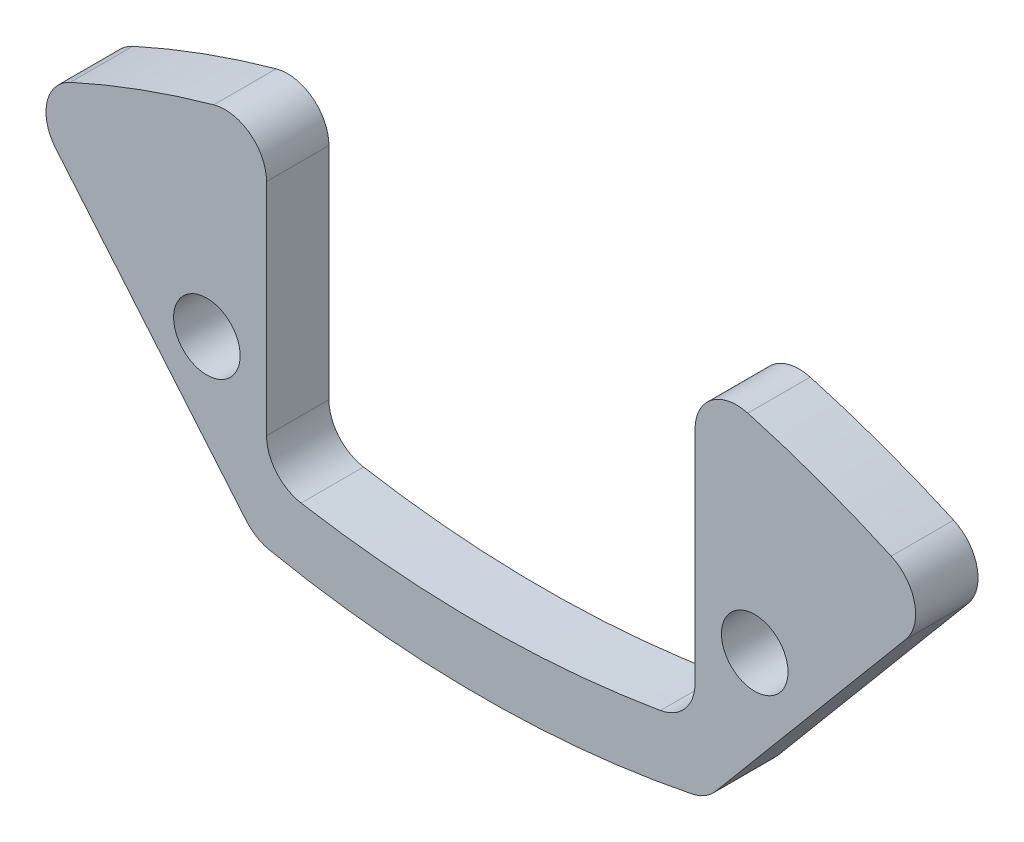
ISO-10303-21;
HEADER;
FILE_DESCRIPTION(('STEP AP214'),'2;1');
FILE_NAME('part.step','',(''),(''),'','','');
FILE_SCHEMA(('AUTOMOTIVE_DESIGN { 1 0 10303 214 1 1 1 1 }'));
ENDSEC;
DATA;
#1=APPLICATION_CONTEXT('core data for automotive mechanical design processes');
#2=APPLICATION_PROTOCOL_DEFINITION('international standard','automotive_design',2000,#1);
#3=PRODUCT_CONTEXT('',#1,'mechanical');
#4=PRODUCT('Part','Part','',(#3));
#5=PRODUCT_RELATED_PRODUCT_CATEGORY('part','',(#4));
#6=PRODUCT_DEFINITION_FORMATION('','',#4);
#7=PRODUCT_DEFINITION_CONTEXT('part definition',#1,'design');
#8=PRODUCT_DEFINITION('design','',#6,#7);
#9=PRODUCT_DEFINITION_SHAPE('','',#8);
#10=(LENGTH_UNIT() NAMED_UNIT(*) SI_UNIT(.MILLI.,.METRE.));
#11=(NAMED_UNIT(*) PLANE_ANGLE_UNIT() SI_UNIT($,.RADIAN.));
#12=(NAMED_UNIT(*) SI_UNIT($,.STERADIAN.) SOLID_ANGLE_UNIT());
#13=UNCERTAINTY_MEASURE_WITH_UNIT(LENGTH_MEASURE(1.E-05),#10,'distance_accuracy_value','');
#14=(GEOMETRIC_REPRESENTATION_CONTEXT(3) GLOBAL_UNCERTAINTY_ASSIGNED_CONTEXT((#13)) GLOBAL_UNIT_ASSIGNED_CONTEXT((#10,
#11,#12)) REPRESENTATION_CONTEXT('',''));
#15=CARTESIAN_POINT('',(0.,0.,0.));
#16=DIRECTION('',(0.,0.,1.));
#17=DIRECTION('',(1.,0.,0.));
#18=AXIS2_PLACEMENT_3D('',#15,#16,#17);
#19=CARTESIAN_POINT('',(0.,0.,3.));
#20=DIRECTION('',(0.,0.,-1.));
#21=DIRECTION('',(-1.,0.,0.));
#22=AXIS2_PLACEMENT_3D('',#19,#20,#21);
#23=CYLINDRICAL_SURFACE('',#22,47.75);
#24=CARTESIAN_POINT('',(0.,0.,3.));
#25=DIRECTION('',(0.,0.,1.));
#26=DIRECTION('',(1.,0.,0.));
#27=AXIS2_PLACEMENT_3D('',#24,#25,#26);
#28=CIRCLE('',#27,47.75);
#29=CARTESIAN_POINT('',(-12.8377049180328,45.9919105108444,3.));
#30=VERTEX_POINT('',#29);
#31=CARTESIAN_POINT('',(-19.7287777073223,43.4837651333812,3.));
#32=VERTEX_POINT('',#31);
#33=EDGE_CURVE('E188',#30,#32,#28,.T.);
#34=ORIENTED_EDGE('',*,*,#33,.F.);
#35=DIRECTION('',(0.,0.,-1.));
#36=VECTOR('',#35,1.);
#37=CARTESIAN_POINT('',(-12.8377049180328,45.9919105108444,3.));
#38=LINE('',#37,#36);
#39=CARTESIAN_POINT('',(-12.8377049180328,45.9919105108444,0.));
#40=VERTEX_POINT('',#39);
#41=EDGE_CURVE('E244',#30,#40,#38,.T.);
#42=ORIENTED_EDGE('',*,*,#41,.T.);
#43=CARTESIAN_POINT('',(0.,0.,0.));
#44=DIRECTION('',(0.,0.,1.));
#45=DIRECTION('',(1.,0.,0.));
#46=AXIS2_PLACEMENT_3D('',#43,#44,#45);
#47=CIRCLE('',#46,47.75);
#48=CARTESIAN_POINT('',(-19.7287777073223,43.4837651333812,0.));
#49=VERTEX_POINT('',#48);
#50=EDGE_CURVE('E194',#40,#49,#47,.T.);
#51=ORIENTED_EDGE('',*,*,#50,.T.);
#52=DIRECTION('',(0.,0.,-1.));
#53=VECTOR('',#52,1.);
#54=CARTESIAN_POINT('',(-19.7287777073223,43.4837651333812,3.));
#55=LINE('',#54,#53);
#56=EDGE_CURVE('E241',#49,#32,#55,.F.);
#57=ORIENTED_EDGE('',*,*,#56,.T.);
#58=EDGE_LOOP('',(#34,#42,#51,#57));
#59=FACE_BOUND('',#58,.T.);
#60=ADVANCED_FACE('F37',(#59),#23,.T.);
#61=CARTESIAN_POINT('',(19.7287777073232,43.4837651333808,3.));
#62=VERTEX_POINT('',#61);
#63=CARTESIAN_POINT('',(12.8377049180328,45.9919105108444,3.));
#64=VERTEX_POINT('',#63);
#65=EDGE_CURVE('E191',#62,#64,#28,.T.);
#66=ORIENTED_EDGE('',*,*,#65,.F.);
#67=DIRECTION('',(0.,0.,-1.));
#68=VECTOR('',#67,1.);
#69=CARTESIAN_POINT('',(19.7287777073232,43.4837651333808,3.));
#70=LINE('',#69,#68);
#71=CARTESIAN_POINT('',(19.7287777073232,43.4837651333808,0.));
#72=VERTEX_POINT('',#71);
#73=EDGE_CURVE('E59',#62,#72,#70,.T.);
#74=ORIENTED_EDGE('',*,*,#73,.T.);
#75=CARTESIAN_POINT('',(12.8377049180328,45.9919105108444,0.));
#76=VERTEX_POINT('',#75);
#77=EDGE_CURVE('E192',#72,#76,#47,.T.);
#78=ORIENTED_EDGE('',*,*,#77,.T.);
#79=DIRECTION('',(0.,0.,-1.));
#80=VECTOR('',#79,1.);
#81=CARTESIAN_POINT('',(12.8377049180328,45.9919105108444,3.));
#82=LINE('',#81,#80);
#83=EDGE_CURVE('E246',#76,#64,#82,.F.);
#84=ORIENTED_EDGE('',*,*,#83,.T.);
#85=EDGE_LOOP('',(#66,#74,#78,#84));
#86=FACE_BOUND('',#85,.T.);
#87=ADVANCED_FACE('F308',(#86),#23,.T.);
#88=CARTESIAN_POINT('',(0.,0.,3.));
#89=DIRECTION('',(0.,0.,1.));
#90=DIRECTION('',(1.,0.,0.));
#91=AXIS2_PLACEMENT_3D('',#88,#89,#90);
#92=PLANE('',#91);
#93=CARTESIAN_POINT('',(-13.167775518038,36.1781659002576,3.));
#94=DIRECTION('',(0.,0.,1.));
#95=DIRECTION('',(1.,0.,0.));
#96=AXIS2_PLACEMENT_3D('',#93,#94,#95);
#97=CIRCLE('',#96,1.6);
#98=CARTESIAN_POINT('',(-11.567775518038,36.1781659002576,3.));
#99=VERTEX_POINT('',#98);
#100=EDGE_CURVE('E288',#99,#99,#97,.T.);
#101=ORIENTED_EDGE('',*,*,#100,.F.);
#102=EDGE_LOOP('',(#101));
#103=FACE_BOUND('',#102,.T.);
#104=CARTESIAN_POINT('',(0.,79.03,3.));
#105=DIRECTION('',(0.,0.,-1.));
#106=DIRECTION('',(1.,0.,0.));
#107=AXIS2_PLACEMENT_3D('',#104,#105,#106);
#108=CIRCLE('',#107,51.25);
#109=CARTESIAN_POINT('',(10.1456730359679,28.7942774646643,3.));
#110=VERTEX_POINT('',#109);
#111=CARTESIAN_POINT('',(-10.1456730359665,28.794277464664,3.));
#112=VERTEX_POINT('',#111);
#113=EDGE_CURVE('E275',#110,#112,#108,.T.);
#114=ORIENTED_EDGE('',*,*,#113,.F.);
#115=CARTESIAN_POINT('',(9.74974433212526,30.7546959050677,3.));
#116=DIRECTION('',(0.,0.,1.));
#117=DIRECTION('',(1.,0.,0.));
#118=AXIS2_PLACEMENT_3D('',#115,#116,#117);
#119=CIRCLE('',#118,2.);
#120=CARTESIAN_POINT('',(11.2818332183632,29.4691206856946,3.));
#121=VERTEX_POINT('',#120);
#122=EDGE_CURVE('E218',#110,#121,#119,.T.);
#123=ORIENTED_EDGE('',*,*,#122,.T.);
#124=DIRECTION('',(-0.642787609686541,-0.766044443118976,0.));
#125=VECTOR('',#124,1.);
#126=CARTESIAN_POINT('',(22.080278910057,42.3382071332041,3.));
#127=LINE('',#126,#125);
#128=CARTESIAN_POINT('',(20.4345303545109,40.3768803796253,3.));
#129=VERTEX_POINT('',#128);
#130=EDGE_CURVE('E278',#129,#121,#127,.T.);
#131=ORIENTED_EDGE('',*,*,#130,.F.);
#132=CARTESIAN_POINT('',(18.902441468273,41.6624555989984,3.));
#133=DIRECTION('',(0.,0.,1.));
#134=DIRECTION('',(1.,0.,0.));
#135=AXIS2_PLACEMENT_3D('',#132,#133,#134);
#136=CIRCLE('',#135,2.);
#137=EDGE_CURVE('E210',#129,#62,#136,.T.);
#138=ORIENTED_EDGE('',*,*,#137,.T.);
#139=ORIENTED_EDGE('',*,*,#65,.T.);
#140=CARTESIAN_POINT('',(12.3,44.0655477669346,3.));
#141=DIRECTION('',(0.,0.,1.));
#142=DIRECTION('',(1.,0.,0.));
#143=AXIS2_PLACEMENT_3D('',#140,#141,#142);
#144=CIRCLE('',#143,2.);
#145=CARTESIAN_POINT('',(10.3,44.0655477669346,3.));
#146=VERTEX_POINT('',#145);
#147=EDGE_CURVE('E177',#64,#146,#144,.T.);
#148=ORIENTED_EDGE('',*,*,#147,.T.);
#149=DIRECTION('',(0.,1.,0.));
#150=VECTOR('',#149,1.);
#151=CARTESIAN_POINT('',(10.3,46.6258780078188,3.));
#152=LINE('',#151,#150);
#153=CARTESIAN_POINT('',(10.3,33.4844286262897,3.));
#154=VERTEX_POINT('',#153);
#155=EDGE_CURVE('E167',#154,#146,#152,.T.);
#156=ORIENTED_EDGE('',*,*,#155,.F.);
#157=CARTESIAN_POINT('',(8.3,33.4844286262897,3.));
#158=DIRECTION('',(0.,0.,1.));
#159=DIRECTION('',(1.,0.,0.));
#160=AXIS2_PLACEMENT_3D('',#157,#158,#159);
#161=CIRCLE('',#160,2.);
#162=CARTESIAN_POINT('',(8.63705583756345,31.5130348649208,3.));
#163=VERTEX_POINT('',#162);
#164=EDGE_CURVE('E151',#154,#163,#161,.F.);
#165=ORIENTED_EDGE('',*,*,#164,.T.);
#166=CARTESIAN_POINT('',(0.,82.03,3.));
#167=DIRECTION('',(0.,0.,1.));
#168=DIRECTION('',(1.,0.,0.));
#169=AXIS2_PLACEMENT_3D('',#166,#167,#168);
#170=CIRCLE('',#169,51.25);
#171=CARTESIAN_POINT('',(-8.63705583756345,31.5130348649208,3.));
#172=VERTEX_POINT('',#171);
#173=EDGE_CURVE('E179',#172,#163,#170,.T.);
#174=ORIENTED_EDGE('',*,*,#173,.F.);
#175=CARTESIAN_POINT('',(-8.3,33.4844286262897,3.));
#176=DIRECTION('',(0.,0.,1.));
#177=DIRECTION('',(1.,0.,0.));
#178=AXIS2_PLACEMENT_3D('',#175,#176,#177);
#179=CIRCLE('',#178,2.);
#180=CARTESIAN_POINT('',(-10.3,33.4844286262897,3.));
#181=VERTEX_POINT('',#180);
#182=EDGE_CURVE('E45',#172,#181,#179,.F.);
#183=ORIENTED_EDGE('',*,*,#182,.T.);
#184=DIRECTION('',(0.,-1.,0.));
#185=VECTOR('',#184,1.);
#186=CARTESIAN_POINT('',(-10.3,46.6258780078188,3.));
#187=LINE('',#186,#185);
#188=CARTESIAN_POINT('',(-10.3,44.0655477669346,3.));
#189=VERTEX_POINT('',#188);
#190=EDGE_CURVE('E184',#189,#181,#187,.T.);
#191=ORIENTED_EDGE('',*,*,#190,.F.);
#192=CARTESIAN_POINT('',(-12.3,44.0655477669346,3.));
#193=DIRECTION('',(0.,0.,1.));
#194=DIRECTION('',(1.,0.,0.));
#195=AXIS2_PLACEMENT_3D('',#192,#193,#194);
#196=CIRCLE('',#195,2.);
#197=EDGE_CURVE('E214',#189,#30,#196,.T.);
#198=ORIENTED_EDGE('',*,*,#197,.T.);
#199=ORIENTED_EDGE('',*,*,#33,.T.);
#200=CARTESIAN_POINT('',(-18.9024414682722,41.6624555989988,3.));
#201=DIRECTION('',(0.,0.,1.));
#202=DIRECTION('',(1.,0.,0.));
#203=AXIS2_PLACEMENT_3D('',#200,#201,#202);
#204=CIRCLE('',#203,2.);
#205=CARTESIAN_POINT('',(-20.4345303545101,40.3768803796257,3.));
#206=VERTEX_POINT('',#205);
#207=EDGE_CURVE('E212',#32,#206,#204,.T.);
#208=ORIENTED_EDGE('',*,*,#207,.T.);
#209=DIRECTION('',(-0.642787609686541,0.766044443118977,0.));
#210=VECTOR('',#209,1.);
#211=CARTESIAN_POINT('',(-22.0802789100562,42.3382071332045,3.));
#212=LINE('',#211,#210);
#213=CARTESIAN_POINT('',(-11.2818332183619,29.4691206856943,3.));
#214=VERTEX_POINT('',#213);
#215=EDGE_CURVE('E271',#214,#206,#212,.T.);
#216=ORIENTED_EDGE('',*,*,#215,.F.);
#217=CARTESIAN_POINT('',(-9.74974433212392,30.7546959050674,3.));
#218=DIRECTION('',(0.,0.,1.));
#219=DIRECTION('',(1.,0.,0.));
#220=AXIS2_PLACEMENT_3D('',#217,#218,#219);
#221=CIRCLE('',#220,2.);
#222=EDGE_CURVE('E216',#214,#112,#221,.T.);
#223=ORIENTED_EDGE('',*,*,#222,.T.);
#224=EDGE_LOOP('',(#114,#123,#131,#138,#139,#148,#156,#165,#174,#183,#191,#198,#199,#208,#216,#223));
#225=FACE_BOUND('',#224,.T.);
#226=CARTESIAN_POINT('',(13.1677755180385,36.1781659002574,3.));
#227=DIRECTION('',(0.,0.,1.));
#228=DIRECTION('',(1.,0.,0.));
#229=AXIS2_PLACEMENT_3D('',#226,#227,#228);
#230=CIRCLE('',#229,1.6);
#231=CARTESIAN_POINT('',(14.7677755180385,36.1781659002574,3.));
#232=VERTEX_POINT('',#231);
#233=EDGE_CURVE('E294',#232,#232,#230,.T.);
#234=ORIENTED_EDGE('',*,*,#233,.F.);
#235=EDGE_LOOP('',(#234));
#236=FACE_BOUND('',#235,.T.);
#237=ADVANCED_FACE('F174',(#103,#225,#236),#92,.T.);
#238=CARTESIAN_POINT('',(0.,0.,0.));
#239=DIRECTION('',(0.,0.,1.));
#240=DIRECTION('',(1.,0.,0.));
#241=AXIS2_PLACEMENT_3D('',#238,#239,#240);
#242=PLANE('',#241);
#243=CARTESIAN_POINT('',(-13.167775518038,36.1781659002576,0.));
#244=DIRECTION('',(0.,0.,1.));
#245=DIRECTION('',(1.,0.,0.));
#246=AXIS2_PLACEMENT_3D('',#243,#244,#245);
#247=CIRCLE('',#246,1.6);
#248=CARTESIAN_POINT('',(-11.567775518038,36.1781659002576,0.));
#249=VERTEX_POINT('',#248);
#250=EDGE_CURVE('E281',#249,#249,#247,.T.);
#251=ORIENTED_EDGE('',*,*,#250,.T.);
#252=EDGE_LOOP('',(#251));
#253=FACE_BOUND('',#252,.T.);
#254=CARTESIAN_POINT('',(13.1677755180385,36.1781659002574,0.));
#255=DIRECTION('',(0.,0.,1.));
#256=DIRECTION('',(1.,0.,0.));
#257=AXIS2_PLACEMENT_3D('',#254,#255,#256);
#258=CIRCLE('',#257,1.6);
#259=CARTESIAN_POINT('',(14.7677755180385,36.1781659002574,0.));
#260=VERTEX_POINT('',#259);
#261=EDGE_CURVE('E291',#260,#260,#258,.T.);
#262=ORIENTED_EDGE('',*,*,#261,.T.);
#263=EDGE_LOOP('',(#262));
#264=FACE_BOUND('',#263,.T.);
#265=DIRECTION('',(-0.642787609686541,-0.766044443118976,0.));
#266=VECTOR('',#265,1.);
#267=CARTESIAN_POINT('',(22.080278910057,42.3382071332041,0.));
#268=LINE('',#267,#266);
#269=CARTESIAN_POINT('',(20.4345303545109,40.3768803796253,0.));
#270=VERTEX_POINT('',#269);
#271=CARTESIAN_POINT('',(11.2818332183632,29.4691206856946,0.));
#272=VERTEX_POINT('',#271);
#273=EDGE_CURVE('E274',#270,#272,#268,.T.);
#274=ORIENTED_EDGE('',*,*,#273,.T.);
#275=CARTESIAN_POINT('',(9.74974433212526,30.7546959050677,0.));
#276=DIRECTION('',(0.,0.,1.));
#277=DIRECTION('',(1.,0.,0.));
#278=AXIS2_PLACEMENT_3D('',#275,#276,#277);
#279=CIRCLE('',#278,2.);
#280=CARTESIAN_POINT('',(10.1456730359679,28.7942774646643,0.));
#281=VERTEX_POINT('',#280);
#282=EDGE_CURVE('E234',#272,#281,#279,.F.);
#283=ORIENTED_EDGE('',*,*,#282,.T.);
#284=CARTESIAN_POINT('',(0.,79.03,0.));
#285=DIRECTION('',(0.,0.,-1.));
#286=DIRECTION('',(1.,0.,0.));
#287=AXIS2_PLACEMENT_3D('',#284,#285,#286);
#288=CIRCLE('',#287,51.25);
#289=CARTESIAN_POINT('',(-10.1456730359665,28.794277464664,0.));
#290=VERTEX_POINT('',#289);
#291=EDGE_CURVE('E284',#281,#290,#288,.T.);
#292=ORIENTED_EDGE('',*,*,#291,.T.);
#293=CARTESIAN_POINT('',(-9.74974433212392,30.7546959050674,0.));
#294=DIRECTION('',(0.,0.,1.));
#295=DIRECTION('',(1.,0.,0.));
#296=AXIS2_PLACEMENT_3D('',#293,#294,#295);
#297=CIRCLE('',#296,2.);
#298=CARTESIAN_POINT('',(-11.2818332183619,29.4691206856943,0.));
#299=VERTEX_POINT('',#298);
#300=EDGE_CURVE('E232',#290,#299,#297,.F.);
#301=ORIENTED_EDGE('',*,*,#300,.T.);
#302=DIRECTION('',(-0.642787609686541,0.766044443118977,0.));
#303=VECTOR('',#302,1.);
#304=CARTESIAN_POINT('',(-22.0802789100562,42.3382071332045,0.));
#305=LINE('',#304,#303);
#306=CARTESIAN_POINT('',(-20.4345303545101,40.3768803796257,0.));
#307=VERTEX_POINT('',#306);
#308=EDGE_CURVE('E259',#299,#307,#305,.T.);
#309=ORIENTED_EDGE('',*,*,#308,.T.);
#310=CARTESIAN_POINT('',(-18.9024414682722,41.6624555989988,0.));
#311=DIRECTION('',(0.,0.,1.));
#312=DIRECTION('',(1.,0.,0.));
#313=AXIS2_PLACEMENT_3D('',#310,#311,#312);
#314=CIRCLE('',#313,2.);
#315=EDGE_CURVE('E228',#307,#49,#314,.F.);
#316=ORIENTED_EDGE('',*,*,#315,.T.);
#317=ORIENTED_EDGE('',*,*,#50,.F.);
#318=CARTESIAN_POINT('',(-12.3,44.0655477669346,0.));
#319=DIRECTION('',(0.,0.,1.));
#320=DIRECTION('',(1.,0.,0.));
#321=AXIS2_PLACEMENT_3D('',#318,#319,#320);
#322=CIRCLE('',#321,2.);
#323=CARTESIAN_POINT('',(-10.3,44.0655477669346,0.));
#324=VERTEX_POINT('',#323);
#325=EDGE_CURVE('E230',#40,#324,#322,.F.);
#326=ORIENTED_EDGE('',*,*,#325,.T.);
#327=DIRECTION('',(0.,-1.,0.));
#328=VECTOR('',#327,1.);
#329=CARTESIAN_POINT('',(-10.3,46.6258780078188,0.));
#330=LINE('',#329,#328);
#331=CARTESIAN_POINT('',(-10.3,33.4844286262897,0.));
#332=VERTEX_POINT('',#331);
#333=EDGE_CURVE('E178',#324,#332,#330,.T.);
#334=ORIENTED_EDGE('',*,*,#333,.T.);
#335=CARTESIAN_POINT('',(-8.3,33.4844286262897,0.));
#336=DIRECTION('',(0.,0.,1.));
#337=DIRECTION('',(1.,0.,0.));
#338=AXIS2_PLACEMENT_3D('',#335,#336,#337);
#339=CIRCLE('',#338,2.);
#340=CARTESIAN_POINT('',(-8.63705583756345,31.5130348649208,0.));
#341=VERTEX_POINT('',#340);
#342=EDGE_CURVE('E11',#332,#341,#339,.T.);
#343=ORIENTED_EDGE('',*,*,#342,.T.);
#344=CARTESIAN_POINT('',(0.,82.03,0.));
#345=DIRECTION('',(0.,0.,1.));
#346=DIRECTION('',(1.,0.,0.));
#347=AXIS2_PLACEMENT_3D('',#344,#345,#346);
#348=CIRCLE('',#347,51.25);
#349=CARTESIAN_POINT('',(8.63705583756345,31.5130348649208,0.));
#350=VERTEX_POINT('',#349);
#351=EDGE_CURVE('E182',#341,#350,#348,.T.);
#352=ORIENTED_EDGE('',*,*,#351,.T.);
#353=CARTESIAN_POINT('',(8.3,33.4844286262897,0.));
#354=DIRECTION('',(0.,0.,1.));
#355=DIRECTION('',(1.,0.,0.));
#356=AXIS2_PLACEMENT_3D('',#353,#354,#355);
#357=CIRCLE('',#356,2.);
#358=CARTESIAN_POINT('',(10.3,33.4844286262897,0.));
#359=VERTEX_POINT('',#358);
#360=EDGE_CURVE('E161',#350,#359,#357,.T.);
#361=ORIENTED_EDGE('',*,*,#360,.T.);
#362=DIRECTION('',(0.,1.,0.));
#363=VECTOR('',#362,1.);
#364=CARTESIAN_POINT('',(10.3,46.6258780078188,0.));
#365=LINE('',#364,#363);
#366=CARTESIAN_POINT('',(10.3,44.0655477669346,0.));
#367=VERTEX_POINT('',#366);
#368=EDGE_CURVE('E169',#359,#367,#365,.T.);
#369=ORIENTED_EDGE('',*,*,#368,.T.);
#370=CARTESIAN_POINT('',(12.3,44.0655477669346,0.));
#371=DIRECTION('',(0.,0.,1.));
#372=DIRECTION('',(1.,0.,0.));
#373=AXIS2_PLACEMENT_3D('',#370,#371,#372);
#374=CIRCLE('',#373,2.);
#375=EDGE_CURVE('E52',#367,#76,#374,.F.);
#376=ORIENTED_EDGE('',*,*,#375,.T.);
#377=ORIENTED_EDGE('',*,*,#77,.F.);
#378=CARTESIAN_POINT('',(18.902441468273,41.6624555989984,0.));
#379=DIRECTION('',(0.,0.,1.));
#380=DIRECTION('',(1.,0.,0.));
#381=AXIS2_PLACEMENT_3D('',#378,#379,#380);
#382=CIRCLE('',#381,2.);
#383=EDGE_CURVE('E226',#72,#270,#382,.F.);
#384=ORIENTED_EDGE('',*,*,#383,.T.);
#385=EDGE_LOOP('',(#274,#283,#292,#301,#309,#316,#317,#326,#334,#343,#352,#361,#369,#376,#377,#384));
#386=FACE_BOUND('',#385,.T.);
#387=ADVANCED_FACE('F265',(#253,#264,#386),#242,.F.);
#388=CARTESIAN_POINT('',(10.3,46.6258780078188,0.));
#389=DIRECTION('',(1.,0.,0.));
#390=DIRECTION('',(0.,0.,-1.));
#391=AXIS2_PLACEMENT_3D('',#388,#389,#390);
#392=PLANE('',#391);
#393=ORIENTED_EDGE('',*,*,#368,.F.);
#394=DIRECTION('',(0.,0.,-1.));
#395=VECTOR('',#394,1.);
#396=CARTESIAN_POINT('',(10.3,33.4844286262897,3.));
#397=LINE('',#396,#395);
#398=EDGE_CURVE('E155',#359,#154,#397,.F.);
#399=ORIENTED_EDGE('',*,*,#398,.T.);
#400=ORIENTED_EDGE('',*,*,#155,.T.);
#401=DIRECTION('',(0.,0.,-1.));
#402=VECTOR('',#401,1.);
#403=CARTESIAN_POINT('',(10.3,44.0655477669346,0.));
#404=LINE('',#403,#402);
#405=EDGE_CURVE('E171',#146,#367,#404,.T.);
#406=ORIENTED_EDGE('',*,*,#405,.T.);
#407=EDGE_LOOP('',(#393,#399,#400,#406));
#408=FACE_BOUND('',#407,.T.);
#409=ADVANCED_FACE('F166',(#408),#392,.F.);
#410=CARTESIAN_POINT('',(0.,82.03,0.));
#411=DIRECTION('',(0.,0.,1.));
#412=DIRECTION('',(1.,0.,0.));
#413=AXIS2_PLACEMENT_3D('',#410,#411,#412);
#414=CYLINDRICAL_SURFACE('',#413,51.25);
#415=ORIENTED_EDGE('',*,*,#173,.T.);
#416=DIRECTION('',(0.,0.,1.));
#417=VECTOR('',#416,1.);
#418=CARTESIAN_POINT('',(8.63705583756345,31.5130348649208,0.));
#419=LINE('',#418,#417);
#420=EDGE_CURVE('E156',#163,#350,#419,.F.);
#421=ORIENTED_EDGE('',*,*,#420,.T.);
#422=ORIENTED_EDGE('',*,*,#351,.F.);
#423=DIRECTION('',(0.,0.,1.));
#424=VECTOR('',#423,1.);
#425=CARTESIAN_POINT('',(-8.63705583756345,31.5130348649208,0.));
#426=LINE('',#425,#424);
#427=EDGE_CURVE('E170',#341,#172,#426,.T.);
#428=ORIENTED_EDGE('',*,*,#427,.T.);
#429=EDGE_LOOP('',(#415,#421,#422,#428));
#430=FACE_BOUND('',#429,.T.);
#431=ADVANCED_FACE('F267',(#430),#414,.F.);
#432=CARTESIAN_POINT('',(-10.3,46.6258780078188,0.));
#433=DIRECTION('',(-1.,0.,0.));
#434=DIRECTION('',(0.,0.,1.));
#435=AXIS2_PLACEMENT_3D('',#432,#433,#434);
#436=PLANE('',#435);
#437=ORIENTED_EDGE('',*,*,#190,.T.);
#438=DIRECTION('',(0.,0.,-1.));
#439=VECTOR('',#438,1.);
#440=CARTESIAN_POINT('',(-10.3,33.4844286262897,0.));
#441=LINE('',#440,#439);
#442=EDGE_CURVE('E202',#181,#332,#441,.T.);
#443=ORIENTED_EDGE('',*,*,#442,.T.);
#444=ORIENTED_EDGE('',*,*,#333,.F.);
#445=DIRECTION('',(0.,0.,-1.));
#446=VECTOR('',#445,1.);
#447=CARTESIAN_POINT('',(-10.3,44.0655477669346,0.));
#448=LINE('',#447,#446);
#449=EDGE_CURVE('E199',#324,#189,#448,.F.);
#450=ORIENTED_EDGE('',*,*,#449,.T.);
#451=EDGE_LOOP('',(#437,#443,#444,#450));
#452=FACE_BOUND('',#451,.T.);
#453=ADVANCED_FACE('F256',(#452),#436,.F.);
#454=CARTESIAN_POINT('',(13.1677755180385,36.1781659002574,0.));
#455=DIRECTION('',(0.,0.,1.));
#456=DIRECTION('',(1.,0.,0.));
#457=AXIS2_PLACEMENT_3D('',#454,#455,#456);
#458=CYLINDRICAL_SURFACE('',#457,1.6);
#459=ORIENTED_EDGE('',*,*,#261,.F.);
#460=EDGE_LOOP('',(#459));
#461=FACE_BOUND('',#460,.T.);
#462=ORIENTED_EDGE('',*,*,#233,.T.);
#463=EDGE_LOOP('',(#462));
#464=FACE_BOUND('',#463,.T.);
#465=ADVANCED_FACE('F301',(#461,#464),#458,.F.);
#466=CARTESIAN_POINT('',(-22.0802789100562,42.3382071332045,0.));
#467=DIRECTION('',(0.766044443118976,0.642787609686541,0.));
#468=DIRECTION('',(-0.642787609686541,0.766044443118977,0.));
#469=AXIS2_PLACEMENT_3D('',#466,#467,#468);
#470=PLANE('',#469);
#471=ORIENTED_EDGE('',*,*,#308,.F.);
#472=DIRECTION('',(0.,0.,1.));
#473=VECTOR('',#472,1.);
#474=CARTESIAN_POINT('',(-11.2818332183619,29.4691206856943,0.));
#475=LINE('',#474,#473);
#476=EDGE_CURVE('E238',#299,#214,#475,.T.);
#477=ORIENTED_EDGE('',*,*,#476,.T.);
#478=ORIENTED_EDGE('',*,*,#215,.T.);
#479=DIRECTION('',(0.,0.,-1.));
#480=VECTOR('',#479,1.);
#481=CARTESIAN_POINT('',(-20.4345303545101,40.3768803796257,0.));
#482=LINE('',#481,#480);
#483=EDGE_CURVE('E236',#206,#307,#482,.T.);
#484=ORIENTED_EDGE('',*,*,#483,.T.);
#485=EDGE_LOOP('',(#471,#477,#478,#484));
#486=FACE_BOUND('',#485,.T.);
#487=ADVANCED_FACE('F304',(#486),#470,.F.);
#488=CARTESIAN_POINT('',(0.,79.03,0.));
#489=DIRECTION('',(0.,0.,1.));
#490=DIRECTION('',(1.,0.,0.));
#491=AXIS2_PLACEMENT_3D('',#488,#489,#490);
#492=CYLINDRICAL_SURFACE('',#491,51.25);
#493=ORIENTED_EDGE('',*,*,#291,.F.);
#494=DIRECTION('',(0.,0.,1.));
#495=VECTOR('',#494,1.);
#496=CARTESIAN_POINT('',(10.1456730359679,28.7942774646643,0.));
#497=LINE('',#496,#495);
#498=EDGE_CURVE('E206',#281,#110,#497,.T.);
#499=ORIENTED_EDGE('',*,*,#498,.T.);
#500=ORIENTED_EDGE('',*,*,#113,.T.);
#501=DIRECTION('',(0.,0.,1.));
#502=VECTOR('',#501,1.);
#503=CARTESIAN_POINT('',(-10.1456730359665,28.794277464664,0.));
#504=LINE('',#503,#502);
#505=EDGE_CURVE('E204',#112,#290,#504,.F.);
#506=ORIENTED_EDGE('',*,*,#505,.T.);
#507=EDGE_LOOP('',(#493,#499,#500,#506));
#508=FACE_BOUND('',#507,.T.);
#509=ADVANCED_FACE('F365',(#508),#492,.T.);
#510=CARTESIAN_POINT('',(22.080278910057,42.3382071332041,0.));
#511=DIRECTION('',(-0.766044443118976,0.642787609686541,0.));
#512=DIRECTION('',(-0.642787609686541,-0.766044443118977,0.));
#513=AXIS2_PLACEMENT_3D('',#510,#511,#512);
#514=PLANE('',#513);
#515=ORIENTED_EDGE('',*,*,#130,.T.);
#516=DIRECTION('',(0.,0.,1.));
#517=VECTOR('',#516,1.);
#518=CARTESIAN_POINT('',(11.2818332183632,29.4691206856946,0.));
#519=LINE('',#518,#517);
#520=EDGE_CURVE('E223',#121,#272,#519,.F.);
#521=ORIENTED_EDGE('',*,*,#520,.T.);
#522=ORIENTED_EDGE('',*,*,#273,.F.);
#523=DIRECTION('',(0.,0.,-1.));
#524=VECTOR('',#523,1.);
#525=CARTESIAN_POINT('',(20.4345303545109,40.3768803796253,0.));
#526=LINE('',#525,#524);
#527=EDGE_CURVE('E220',#270,#129,#526,.F.);
#528=ORIENTED_EDGE('',*,*,#527,.T.);
#529=EDGE_LOOP('',(#515,#521,#522,#528));
#530=FACE_BOUND('',#529,.T.);
#531=ADVANCED_FACE('F358',(#530),#514,.F.);
#532=CARTESIAN_POINT('',(-13.167775518038,36.1781659002576,0.));
#533=DIRECTION('',(0.,0.,1.));
#534=DIRECTION('',(1.,0.,0.));
#535=AXIS2_PLACEMENT_3D('',#532,#533,#534);
#536=CYLINDRICAL_SURFACE('',#535,1.6);
#537=ORIENTED_EDGE('',*,*,#250,.F.);
#538=EDGE_LOOP('',(#537));
#539=FACE_BOUND('',#538,.T.);
#540=ORIENTED_EDGE('',*,*,#100,.T.);
#541=EDGE_LOOP('',(#540));
#542=FACE_BOUND('',#541,.T.);
#543=ADVANCED_FACE('F328',(#539,#542),#536,.F.);
#544=CARTESIAN_POINT('',(8.3,33.4844286262897,0.));
#545=DIRECTION('',(0.,0.,1.));
#546=DIRECTION('',(1.,0.,0.));
#547=AXIS2_PLACEMENT_3D('',#544,#545,#546);
#548=CYLINDRICAL_SURFACE('',#547,2.);
#549=ORIENTED_EDGE('',*,*,#360,.F.);
#550=ORIENTED_EDGE('',*,*,#420,.F.);
#551=ORIENTED_EDGE('',*,*,#164,.F.);
#552=ORIENTED_EDGE('',*,*,#398,.F.);
#553=EDGE_LOOP('',(#549,#550,#551,#552));
#554=FACE_BOUND('',#553,.T.);
#555=ADVANCED_FACE('F154',(#554),#548,.F.);
#556=CARTESIAN_POINT('',(-8.3,33.4844286262897,0.));
#557=DIRECTION('',(0.,0.,1.));
#558=DIRECTION('',(1.,0.,0.));
#559=AXIS2_PLACEMENT_3D('',#556,#557,#558);
#560=CYLINDRICAL_SURFACE('',#559,2.);
#561=ORIENTED_EDGE('',*,*,#342,.F.);
#562=ORIENTED_EDGE('',*,*,#442,.F.);
#563=ORIENTED_EDGE('',*,*,#182,.F.);
#564=ORIENTED_EDGE('',*,*,#427,.F.);
#565=EDGE_LOOP('',(#561,#562,#563,#564));
#566=FACE_BOUND('',#565,.T.);
#567=ADVANCED_FACE('F261',(#566),#560,.F.);
#568=CARTESIAN_POINT('',(9.74974433212526,30.7546959050677,0.));
#569=DIRECTION('',(0.,0.,1.));
#570=DIRECTION('',(1.,0.,0.));
#571=AXIS2_PLACEMENT_3D('',#568,#569,#570);
#572=CYLINDRICAL_SURFACE('',#571,2.);
#573=ORIENTED_EDGE('',*,*,#282,.F.);
#574=ORIENTED_EDGE('',*,*,#520,.F.);
#575=ORIENTED_EDGE('',*,*,#122,.F.);
#576=ORIENTED_EDGE('',*,*,#498,.F.);
#577=EDGE_LOOP('',(#573,#574,#575,#576));
#578=FACE_BOUND('',#577,.T.);
#579=ADVANCED_FACE('F331',(#578),#572,.T.);
#580=CARTESIAN_POINT('',(-9.74974433212392,30.7546959050674,0.));
#581=DIRECTION('',(0.,0.,1.));
#582=DIRECTION('',(1.,0.,0.));
#583=AXIS2_PLACEMENT_3D('',#580,#581,#582);
#584=CYLINDRICAL_SURFACE('',#583,2.);
#585=ORIENTED_EDGE('',*,*,#300,.F.);
#586=ORIENTED_EDGE('',*,*,#505,.F.);
#587=ORIENTED_EDGE('',*,*,#222,.F.);
#588=ORIENTED_EDGE('',*,*,#476,.F.);
#589=EDGE_LOOP('',(#585,#586,#587,#588));
#590=FACE_BOUND('',#589,.T.);
#591=ADVANCED_FACE('F334',(#590),#584,.T.);
#592=CARTESIAN_POINT('',(-12.3,44.0655477669346,3.));
#593=DIRECTION('',(0.,0.,-1.));
#594=DIRECTION('',(-1.,0.,0.));
#595=AXIS2_PLACEMENT_3D('',#592,#593,#594);
#596=CYLINDRICAL_SURFACE('',#595,2.);
#597=ORIENTED_EDGE('',*,*,#325,.F.);
#598=ORIENTED_EDGE('',*,*,#41,.F.);
#599=ORIENTED_EDGE('',*,*,#197,.F.);
#600=ORIENTED_EDGE('',*,*,#449,.F.);
#601=EDGE_LOOP('',(#597,#598,#599,#600));
#602=FACE_BOUND('',#601,.T.);
#603=ADVANCED_FACE('F338',(#602),#596,.T.);
#604=CARTESIAN_POINT('',(-18.9024414682722,41.6624555989988,3.));
#605=DIRECTION('',(0.,0.,-1.));
#606=DIRECTION('',(-1.,0.,0.));
#607=AXIS2_PLACEMENT_3D('',#604,#605,#606);
#608=CYLINDRICAL_SURFACE('',#607,2.);
#609=ORIENTED_EDGE('',*,*,#315,.F.);
#610=ORIENTED_EDGE('',*,*,#483,.F.);
#611=ORIENTED_EDGE('',*,*,#207,.F.);
#612=ORIENTED_EDGE('',*,*,#56,.F.);
#613=EDGE_LOOP('',(#609,#610,#611,#612));
#614=FACE_BOUND('',#613,.T.);
#615=ADVANCED_FACE('F342',(#614),#608,.T.);
#616=CARTESIAN_POINT('',(18.902441468273,41.6624555989984,3.));
#617=DIRECTION('',(0.,0.,-1.));
#618=DIRECTION('',(-1.,0.,0.));
#619=AXIS2_PLACEMENT_3D('',#616,#617,#618);
#620=CYLINDRICAL_SURFACE('',#619,2.);
#621=ORIENTED_EDGE('',*,*,#383,.F.);
#622=ORIENTED_EDGE('',*,*,#73,.F.);
#623=ORIENTED_EDGE('',*,*,#137,.F.);
#624=ORIENTED_EDGE('',*,*,#527,.F.);
#625=EDGE_LOOP('',(#621,#622,#623,#624));
#626=FACE_BOUND('',#625,.T.);
#627=ADVANCED_FACE('F345',(#626),#620,.T.);
#628=CARTESIAN_POINT('',(12.3,44.0655477669346,3.));
#629=DIRECTION('',(0.,0.,-1.));
#630=DIRECTION('',(-1.,0.,0.));
#631=AXIS2_PLACEMENT_3D('',#628,#629,#630);
#632=CYLINDRICAL_SURFACE('',#631,2.);
#633=ORIENTED_EDGE('',*,*,#375,.F.);
#634=ORIENTED_EDGE('',*,*,#405,.F.);
#635=ORIENTED_EDGE('',*,*,#147,.F.);
#636=ORIENTED_EDGE('',*,*,#83,.F.);
#637=EDGE_LOOP('',(#633,#634,#635,#636));
#638=FACE_BOUND('',#637,.T.);
#639=ADVANCED_FACE('F39',(#638),#632,.T.);
#640=CLOSED_SHELL('',(#60,#87,#237,#387,#409,#431,#453,#465,#487,#509,#531,#543,#555,#567,#579,
#591,#603,#615,#627,#639));
#641=MANIFOLD_SOLID_BREP('B2',#640);
#642=ADVANCED_BREP_SHAPE_REPRESENTATION('',(#18,#641),#14);
#643=SHAPE_DEFINITION_REPRESENTATION(#9,#642);
ENDSEC;
END-ISO-10303-21;
